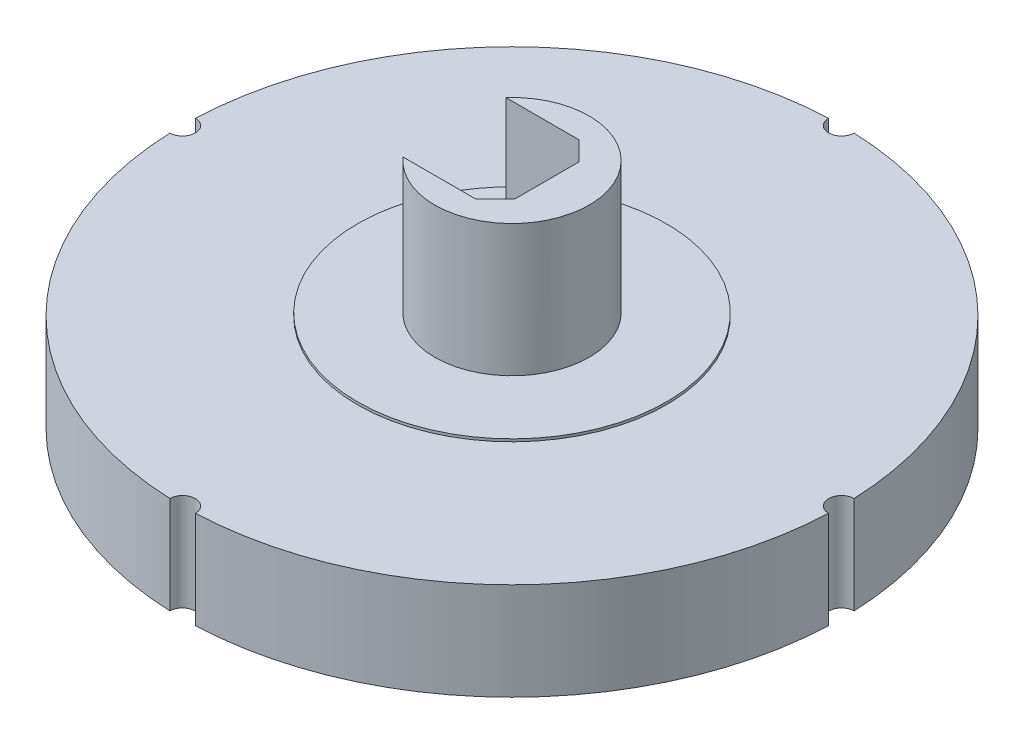
ISO-10303-21;
HEADER;
FILE_DESCRIPTION(('STEP AP214'),'2;1');
FILE_NAME('part.step','',(''),(''),'','','');
FILE_SCHEMA(('AUTOMOTIVE_DESIGN { 1 0 10303 214 1 1 1 1 }'));
ENDSEC;
DATA;
#1=APPLICATION_CONTEXT('core data for automotive mechanical design processes');
#2=APPLICATION_PROTOCOL_DEFINITION('international standard','automotive_design',2000,#1);
#3=PRODUCT_CONTEXT('',#1,'mechanical');
#4=PRODUCT('Part','Part','',(#3));
#5=PRODUCT_RELATED_PRODUCT_CATEGORY('part','',(#4));
#6=PRODUCT_DEFINITION_FORMATION('','',#4);
#7=PRODUCT_DEFINITION_CONTEXT('part definition',#1,'design');
#8=PRODUCT_DEFINITION('design','',#6,#7);
#9=PRODUCT_DEFINITION_SHAPE('','',#8);
#10=(LENGTH_UNIT() NAMED_UNIT(*) SI_UNIT(.MILLI.,.METRE.));
#11=(NAMED_UNIT(*) PLANE_ANGLE_UNIT() SI_UNIT($,.RADIAN.));
#12=(NAMED_UNIT(*) SI_UNIT($,.STERADIAN.) SOLID_ANGLE_UNIT());
#13=UNCERTAINTY_MEASURE_WITH_UNIT(LENGTH_MEASURE(1.E-05),#10,'distance_accuracy_value','');
#14=(GEOMETRIC_REPRESENTATION_CONTEXT(3) GLOBAL_UNCERTAINTY_ASSIGNED_CONTEXT((#13)) GLOBAL_UNIT_ASSIGNED_CONTEXT((#10,
#11,#12)) REPRESENTATION_CONTEXT('',''));
#15=CARTESIAN_POINT('',(0.,0.,0.));
#16=DIRECTION('',(0.,0.,1.));
#17=DIRECTION('',(1.,0.,0.));
#18=AXIS2_PLACEMENT_3D('',#15,#16,#17);
#19=CARTESIAN_POINT('',(0.,8.62025316455697,0.));
#20=DIRECTION('',(0.,1.,0.));
#21=DIRECTION('',(0.,0.,1.));
#22=AXIS2_PLACEMENT_3D('',#19,#20,#21);
#23=CYLINDRICAL_SURFACE('',#22,12.805);
#24=CARTESIAN_POINT('',(0.,3.785,0.));
#25=DIRECTION('',(0.,1.,0.));
#26=DIRECTION('',(0.,0.,1.));
#27=AXIS2_PLACEMENT_3D('',#24,#25,#26);
#28=CIRCLE('',#27,12.805);
#29=CARTESIAN_POINT('',(-0.499904697948046,3.785,-12.7952381882077));
#30=VERTEX_POINT('',#29);
#31=CARTESIAN_POINT('',(-12.7952381882077,3.785,-0.499904697948061));
#32=VERTEX_POINT('',#31);
#33=EDGE_CURVE('E184',#30,#32,#28,.T.);
#34=ORIENTED_EDGE('',*,*,#33,.F.);
#35=DIRECTION('',(0.,-1.,0.));
#36=VECTOR('',#35,1.);
#37=CARTESIAN_POINT('',(-0.499904697948051,4.504994,-12.7952381882077));
#38=LINE('',#37,#36);
#39=CARTESIAN_POINT('',(-0.499904697948073,0.,-12.7952381882077));
#40=VERTEX_POINT('',#39);
#41=EDGE_CURVE('E288',#30,#40,#38,.T.);
#42=ORIENTED_EDGE('',*,*,#41,.T.);
#43=CARTESIAN_POINT('',(0.,0.,0.));
#44=DIRECTION('',(0.,1.,0.));
#45=DIRECTION('',(0.,0.,1.));
#46=AXIS2_PLACEMENT_3D('',#43,#44,#45);
#47=CIRCLE('',#46,12.805);
#48=CARTESIAN_POINT('',(-12.7952381882077,0.,-0.499904697948073));
#49=VERTEX_POINT('',#48);
#50=EDGE_CURVE('E187',#40,#49,#47,.T.);
#51=ORIENTED_EDGE('',*,*,#50,.T.);
#52=DIRECTION('',(0.,-1.,0.));
#53=VECTOR('',#52,1.);
#54=CARTESIAN_POINT('',(-12.7952381882077,4.504994,-0.499904697948052));
#55=LINE('',#54,#53);
#56=EDGE_CURVE('E73',#49,#32,#55,.F.);
#57=ORIENTED_EDGE('',*,*,#56,.T.);
#58=EDGE_LOOP('',(#34,#42,#51,#57));
#59=FACE_BOUND('',#58,.T.);
#60=ADVANCED_FACE('F48',(#59),#23,.T.);
#61=CARTESIAN_POINT('',(-12.7952381882077,3.785,0.499904697948045));
#62=VERTEX_POINT('',#61);
#63=CARTESIAN_POINT('',(-0.499904697948051,3.785,12.7952381882077));
#64=VERTEX_POINT('',#63);
#65=EDGE_CURVE('E177',#62,#64,#28,.T.);
#66=ORIENTED_EDGE('',*,*,#65,.F.);
#67=DIRECTION('',(0.,-1.,0.));
#68=VECTOR('',#67,1.);
#69=CARTESIAN_POINT('',(-12.7952381882077,4.504994,0.499904697948052));
#70=LINE('',#69,#68);
#71=CARTESIAN_POINT('',(-12.7952381882077,0.,0.499904697948073));
#72=VERTEX_POINT('',#71);
#73=EDGE_CURVE('E303',#62,#72,#70,.T.);
#74=ORIENTED_EDGE('',*,*,#73,.T.);
#75=CARTESIAN_POINT('',(-0.499904697948073,0.,12.7952381882077));
#76=VERTEX_POINT('',#75);
#77=EDGE_CURVE('E180',#72,#76,#47,.T.);
#78=ORIENTED_EDGE('',*,*,#77,.T.);
#79=DIRECTION('',(0.,-1.,0.));
#80=VECTOR('',#79,1.);
#81=CARTESIAN_POINT('',(-0.499904697948051,4.504994,12.7952381882077));
#82=LINE('',#81,#80);
#83=EDGE_CURVE('E65',#76,#64,#82,.F.);
#84=ORIENTED_EDGE('',*,*,#83,.T.);
#85=EDGE_LOOP('',(#66,#74,#78,#84));
#86=FACE_BOUND('',#85,.T.);
#87=ADVANCED_FACE('F323',(#86),#23,.T.);
#88=CARTESIAN_POINT('',(12.7952381882077,0.,-0.499904697948073));
#89=VERTEX_POINT('',#88);
#90=CARTESIAN_POINT('',(0.499904697948073,0.,-12.7952381882077));
#91=VERTEX_POINT('',#90);
#92=EDGE_CURVE('E178',#89,#91,#47,.T.);
#93=ORIENTED_EDGE('',*,*,#92,.T.);
#94=DIRECTION('',(0.,-1.,0.));
#95=VECTOR('',#94,1.);
#96=CARTESIAN_POINT('',(0.499904697948051,4.504994,-12.7952381882077));
#97=LINE('',#96,#95);
#98=CARTESIAN_POINT('',(0.499904697948049,3.785,-12.7952381882077));
#99=VERTEX_POINT('',#98);
#100=EDGE_CURVE('E292',#91,#99,#97,.F.);
#101=ORIENTED_EDGE('',*,*,#100,.T.);
#102=CARTESIAN_POINT('',(12.7952381882077,3.785,-0.499904697948053));
#103=VERTEX_POINT('',#102);
#104=EDGE_CURVE('E362',#103,#99,#28,.T.);
#105=ORIENTED_EDGE('',*,*,#104,.F.);
#106=DIRECTION('',(0.,-1.,0.));
#107=VECTOR('',#106,1.);
#108=CARTESIAN_POINT('',(12.7952381882077,4.504994,-0.499904697948052));
#109=LINE('',#108,#107);
#110=EDGE_CURVE('E312',#103,#89,#109,.T.);
#111=ORIENTED_EDGE('',*,*,#110,.T.);
#112=EDGE_LOOP('',(#93,#101,#105,#111));
#113=FACE_BOUND('',#112,.T.);
#114=ADVANCED_FACE('F345',(#113),#23,.T.);
#115=CARTESIAN_POINT('',(0.,9.01,0.));
#116=DIRECTION('',(0.,-1.,0.));
#117=DIRECTION('',(0.,0.,-1.));
#118=AXIS2_PLACEMENT_3D('',#115,#116,#117);
#119=PLANE('',#118);
#120=CARTESIAN_POINT('',(0.,9.01,0.));
#121=DIRECTION('',(0.,1.,0.));
#122=DIRECTION('',(0.,0.,1.));
#123=AXIS2_PLACEMENT_3D('',#120,#121,#122);
#124=CIRCLE('',#123,3.);
#125=CARTESIAN_POINT('',(-2.23606797749979,9.01,2.));
#126=VERTEX_POINT('',#125);
#127=CARTESIAN_POINT('',(-2.23606797749979,9.01,-2.));
#128=VERTEX_POINT('',#127);
#129=EDGE_CURVE('E232',#126,#128,#124,.T.);
#130=ORIENTED_EDGE('',*,*,#129,.T.);
#131=DIRECTION('',(-1.,0.,0.));
#132=VECTOR('',#131,1.);
#133=CARTESIAN_POINT('',(1.35,9.01,-2.));
#134=LINE('',#133,#132);
#135=CARTESIAN_POINT('',(0.599999999999999,9.01,-2.));
#136=VERTEX_POINT('',#135);
#137=EDGE_CURVE('E203',#136,#128,#134,.T.);
#138=ORIENTED_EDGE('',*,*,#137,.F.);
#139=DIRECTION('',(-0.707106781186544,0.,-0.707106781186551));
#140=VECTOR('',#139,1.);
#141=CARTESIAN_POINT('',(1.3,9.01,-1.29999999999999));
#142=LINE('',#141,#140);
#143=CARTESIAN_POINT('',(1.35,9.01,-1.24999999999999));
#144=VERTEX_POINT('',#143);
#145=EDGE_CURVE('E269',#136,#144,#142,.F.);
#146=ORIENTED_EDGE('',*,*,#145,.T.);
#147=DIRECTION('',(0.,0.,-1.));
#148=VECTOR('',#147,1.);
#149=CARTESIAN_POINT('',(1.35,9.01,2.));
#150=LINE('',#149,#148);
#151=CARTESIAN_POINT('',(1.35,9.01,1.24999999999999));
#152=VERTEX_POINT('',#151);
#153=EDGE_CURVE('E211',#152,#144,#150,.T.);
#154=ORIENTED_EDGE('',*,*,#153,.F.);
#155=DIRECTION('',(0.707106781186544,0.,-0.707106781186551));
#156=VECTOR('',#155,1.);
#157=CARTESIAN_POINT('',(1.3,9.01,1.29999999999999));
#158=LINE('',#157,#156);
#159=CARTESIAN_POINT('',(0.6,9.01,2.));
#160=VERTEX_POINT('',#159);
#161=EDGE_CURVE('E159',#152,#160,#158,.F.);
#162=ORIENTED_EDGE('',*,*,#161,.T.);
#163=DIRECTION('',(1.,0.,0.));
#164=VECTOR('',#163,1.);
#165=CARTESIAN_POINT('',(1.35,9.01,2.));
#166=LINE('',#165,#164);
#167=EDGE_CURVE('E207',#126,#160,#166,.T.);
#168=ORIENTED_EDGE('',*,*,#167,.F.);
#169=EDGE_LOOP('',(#130,#138,#146,#154,#162,#168));
#170=FACE_BOUND('',#169,.T.);
#171=ADVANCED_FACE('F238',(#170),#119,.F.);
#172=CARTESIAN_POINT('',(0.,8.62025316455697,0.));
#173=DIRECTION('',(0.,1.,0.));
#174=DIRECTION('',(0.,0.,1.));
#175=AXIS2_PLACEMENT_3D('',#172,#173,#174);
#176=CYLINDRICAL_SURFACE('',#175,3.);
#177=CARTESIAN_POINT('',(0.,4.51,0.));
#178=DIRECTION('',(0.,1.,0.));
#179=DIRECTION('',(0.,0.,1.));
#180=AXIS2_PLACEMENT_3D('',#177,#178,#179);
#181=CIRCLE('',#180,3.);
#182=CARTESIAN_POINT('',(-2.23606797749979,4.51,-2.));
#183=VERTEX_POINT('',#182);
#184=CARTESIAN_POINT('',(-2.23606797749979,4.51,2.));
#185=VERTEX_POINT('',#184);
#186=EDGE_CURVE('E233',#183,#185,#181,.T.);
#187=ORIENTED_EDGE('',*,*,#186,.F.);
#188=DIRECTION('',(0.,1.,0.));
#189=VECTOR('',#188,1.);
#190=CARTESIAN_POINT('',(-2.23606797749979,8.62025316455697,-2.));
#191=LINE('',#190,#189);
#192=EDGE_CURVE('E221',#183,#128,#191,.T.);
#193=ORIENTED_EDGE('',*,*,#192,.T.);
#194=ORIENTED_EDGE('',*,*,#129,.F.);
#195=DIRECTION('',(0.,1.,0.));
#196=VECTOR('',#195,1.);
#197=CARTESIAN_POINT('',(-2.23606797749979,8.62025316455697,2.));
#198=LINE('',#197,#196);
#199=EDGE_CURVE('E235',#126,#185,#198,.F.);
#200=ORIENTED_EDGE('',*,*,#199,.T.);
#201=EDGE_LOOP('',(#187,#193,#194,#200));
#202=FACE_BOUND('',#201,.T.);
#203=CARTESIAN_POINT('',(0.,3.885,0.));
#204=DIRECTION('',(0.,1.,0.));
#205=DIRECTION('',(0.,0.,1.));
#206=AXIS2_PLACEMENT_3D('',#203,#204,#205);
#207=CIRCLE('',#206,3.);
#208=CARTESIAN_POINT('',(0.,3.885,3.));
#209=VERTEX_POINT('',#208);
#210=EDGE_CURVE('E240',#209,#209,#207,.T.);
#211=ORIENTED_EDGE('',*,*,#210,.T.);
#212=EDGE_LOOP('',(#211));
#213=FACE_BOUND('',#212,.T.);
#214=ADVANCED_FACE('F229',(#202,#213),#176,.T.);
#215=CARTESIAN_POINT('',(3.,3.885,0.));
#216=DIRECTION('',(0.,-1.,0.));
#217=DIRECTION('',(0.,0.,-1.));
#218=AXIS2_PLACEMENT_3D('',#215,#216,#217);
#219=PLANE('',#218);
#220=ORIENTED_EDGE('',*,*,#210,.F.);
#221=EDGE_LOOP('',(#220));
#222=FACE_BOUND('',#221,.T.);
#223=CARTESIAN_POINT('',(0.,3.885,0.));
#224=DIRECTION('',(0.,1.,0.));
#225=DIRECTION('',(0.,0.,1.));
#226=AXIS2_PLACEMENT_3D('',#223,#224,#225);
#227=CIRCLE('',#226,6.);
#228=CARTESIAN_POINT('',(0.,3.885,6.));
#229=VERTEX_POINT('',#228);
#230=EDGE_CURVE('E246',#229,#229,#227,.T.);
#231=ORIENTED_EDGE('',*,*,#230,.T.);
#232=EDGE_LOOP('',(#231));
#233=FACE_BOUND('',#232,.T.);
#234=ADVANCED_FACE('F374',(#222,#233),#219,.F.);
#235=CARTESIAN_POINT('',(0.,8.62025316455697,0.));
#236=DIRECTION('',(0.,1.,0.));
#237=DIRECTION('',(0.,0.,1.));
#238=AXIS2_PLACEMENT_3D('',#235,#236,#237);
#239=CYLINDRICAL_SURFACE('',#238,6.);
#240=ORIENTED_EDGE('',*,*,#230,.F.);
#241=EDGE_LOOP('',(#240));
#242=FACE_BOUND('',#241,.T.);
#243=CARTESIAN_POINT('',(0.,3.785,0.));
#244=DIRECTION('',(0.,1.,0.));
#245=DIRECTION('',(0.,0.,1.));
#246=AXIS2_PLACEMENT_3D('',#243,#244,#245);
#247=CIRCLE('',#246,6.);
#248=CARTESIAN_POINT('',(0.,3.785,6.));
#249=VERTEX_POINT('',#248);
#250=EDGE_CURVE('E366',#249,#249,#247,.T.);
#251=ORIENTED_EDGE('',*,*,#250,.T.);
#252=EDGE_LOOP('',(#251));
#253=FACE_BOUND('',#252,.T.);
#254=ADVANCED_FACE('F353',(#242,#253),#239,.T.);
#255=CARTESIAN_POINT('',(6.,3.785,0.));
#256=DIRECTION('',(0.,-1.,0.));
#257=DIRECTION('',(0.,0.,-1.));
#258=AXIS2_PLACEMENT_3D('',#255,#256,#257);
#259=PLANE('',#258);
#260=ORIENTED_EDGE('',*,*,#250,.F.);
#261=EDGE_LOOP('',(#260));
#262=FACE_BOUND('',#261,.T.);
#263=ORIENTED_EDGE('',*,*,#104,.T.);
#264=CARTESIAN_POINT('',(0.,3.785,-12.805));
#265=DIRECTION('',(0.,-1.,0.));
#266=DIRECTION('',(0.,0.,-1.));
#267=AXIS2_PLACEMENT_3D('',#264,#265,#266);
#268=CIRCLE('',#267,0.5);
#269=EDGE_CURVE('E278',#99,#30,#268,.T.);
#270=ORIENTED_EDGE('',*,*,#269,.T.);
#271=ORIENTED_EDGE('',*,*,#33,.T.);
#272=CARTESIAN_POINT('',(-12.805,3.785,0.));
#273=DIRECTION('',(0.,-1.,0.));
#274=DIRECTION('',(0.,0.,-1.));
#275=AXIS2_PLACEMENT_3D('',#272,#273,#274);
#276=CIRCLE('',#275,0.500000000000001);
#277=EDGE_CURVE('E297',#32,#62,#276,.T.);
#278=ORIENTED_EDGE('',*,*,#277,.T.);
#279=ORIENTED_EDGE('',*,*,#65,.T.);
#280=CARTESIAN_POINT('',(0.,3.785,12.805));
#281=DIRECTION('',(0.,-1.,0.));
#282=DIRECTION('',(0.,0.,-1.));
#283=AXIS2_PLACEMENT_3D('',#280,#281,#282);
#284=CIRCLE('',#283,0.5);
#285=CARTESIAN_POINT('',(0.499904697948051,3.785,12.7952381882077));
#286=VERTEX_POINT('',#285);
#287=EDGE_CURVE('E170',#64,#286,#284,.T.);
#288=ORIENTED_EDGE('',*,*,#287,.T.);
#289=CARTESIAN_POINT('',(12.7952381882077,3.785,0.499904697948051));
#290=VERTEX_POINT('',#289);
#291=EDGE_CURVE('E168',#286,#290,#28,.T.);
#292=ORIENTED_EDGE('',*,*,#291,.T.);
#293=CARTESIAN_POINT('',(12.805,3.785,0.));
#294=DIRECTION('',(0.,-1.,0.));
#295=DIRECTION('',(0.,0.,-1.));
#296=AXIS2_PLACEMENT_3D('',#293,#294,#295);
#297=CIRCLE('',#296,0.500000000000001);
#298=EDGE_CURVE('E308',#290,#103,#297,.T.);
#299=ORIENTED_EDGE('',*,*,#298,.T.);
#300=EDGE_LOOP('',(#263,#270,#271,#278,#279,#288,#292,#299));
#301=FACE_BOUND('',#300,.T.);
#302=ADVANCED_FACE('F326',(#262,#301),#259,.F.);
#303=CARTESIAN_POINT('',(0.499904697948073,0.,12.7952381882077));
#304=VERTEX_POINT('',#303);
#305=CARTESIAN_POINT('',(12.7952381882077,0.,0.499904697948073));
#306=VERTEX_POINT('',#305);
#307=EDGE_CURVE('E166',#304,#306,#47,.T.);
#308=ORIENTED_EDGE('',*,*,#307,.T.);
#309=DIRECTION('',(0.,-1.,0.));
#310=VECTOR('',#309,1.);
#311=CARTESIAN_POINT('',(12.7952381882077,4.504994,0.499904697948052));
#312=LINE('',#311,#310);
#313=EDGE_CURVE('E316',#306,#290,#312,.F.);
#314=ORIENTED_EDGE('',*,*,#313,.T.);
#315=ORIENTED_EDGE('',*,*,#291,.F.);
#316=DIRECTION('',(0.,-1.,0.));
#317=VECTOR('',#316,1.);
#318=CARTESIAN_POINT('',(0.499904697948051,4.504994,12.7952381882077));
#319=LINE('',#318,#317);
#320=EDGE_CURVE('E151',#286,#304,#319,.T.);
#321=ORIENTED_EDGE('',*,*,#320,.T.);
#322=EDGE_LOOP('',(#308,#314,#315,#321));
#323=FACE_BOUND('',#322,.T.);
#324=ADVANCED_FACE('F164',(#323),#23,.T.);
#325=CARTESIAN_POINT('',(12.805,0.,0.));
#326=DIRECTION('',(0.,1.,0.));
#327=DIRECTION('',(0.,0.,1.));
#328=AXIS2_PLACEMENT_3D('',#325,#326,#327);
#329=PLANE('',#328);
#330=ORIENTED_EDGE('',*,*,#50,.F.);
#331=CARTESIAN_POINT('',(0.,0.,-12.805));
#332=DIRECTION('',(0.,1.,0.));
#333=DIRECTION('',(0.,0.,1.));
#334=AXIS2_PLACEMENT_3D('',#331,#332,#333);
#335=CIRCLE('',#334,0.5);
#336=EDGE_CURVE('E12',#40,#91,#335,.T.);
#337=ORIENTED_EDGE('',*,*,#336,.T.);
#338=ORIENTED_EDGE('',*,*,#92,.F.);
#339=CARTESIAN_POINT('',(12.805,0.,0.));
#340=DIRECTION('',(0.,1.,0.));
#341=DIRECTION('',(0.,0.,1.));
#342=AXIS2_PLACEMENT_3D('',#339,#340,#341);
#343=CIRCLE('',#342,0.500000000000001);
#344=EDGE_CURVE('E158',#89,#306,#343,.T.);
#345=ORIENTED_EDGE('',*,*,#344,.T.);
#346=ORIENTED_EDGE('',*,*,#307,.F.);
#347=CARTESIAN_POINT('',(0.,0.,12.805));
#348=DIRECTION('',(0.,1.,0.));
#349=DIRECTION('',(0.,0.,1.));
#350=AXIS2_PLACEMENT_3D('',#347,#348,#349);
#351=CIRCLE('',#350,0.5);
#352=EDGE_CURVE('E148',#304,#76,#351,.T.);
#353=ORIENTED_EDGE('',*,*,#352,.T.);
#354=ORIENTED_EDGE('',*,*,#77,.F.);
#355=CARTESIAN_POINT('',(-12.805,0.,0.));
#356=DIRECTION('',(0.,1.,0.));
#357=DIRECTION('',(0.,0.,1.));
#358=AXIS2_PLACEMENT_3D('',#355,#356,#357);
#359=CIRCLE('',#358,0.500000000000001);
#360=EDGE_CURVE('E58',#72,#49,#359,.T.);
#361=ORIENTED_EDGE('',*,*,#360,.T.);
#362=EDGE_LOOP('',(#330,#337,#338,#345,#346,#353,#354,#361));
#363=FACE_BOUND('',#362,.T.);
#364=ADVANCED_FACE('F174',(#363),#329,.F.);
#365=CARTESIAN_POINT('',(1.35,4.51,-2.));
#366=DIRECTION('',(0.,0.,-1.));
#367=DIRECTION('',(-1.,0.,0.));
#368=AXIS2_PLACEMENT_3D('',#365,#366,#367);
#369=PLANE('',#368);
#370=DIRECTION('',(-1.,0.,0.));
#371=VECTOR('',#370,1.);
#372=CARTESIAN_POINT('',(1.35,4.51,-2.));
#373=LINE('',#372,#371);
#374=CARTESIAN_POINT('',(0.599999999999999,4.51,-2.));
#375=VERTEX_POINT('',#374);
#376=EDGE_CURVE('E190',#375,#183,#373,.T.);
#377=ORIENTED_EDGE('',*,*,#376,.F.);
#378=DIRECTION('',(0.,1.,0.));
#379=VECTOR('',#378,1.);
#380=CARTESIAN_POINT('',(0.599999999999999,9.01,-2.));
#381=LINE('',#380,#379);
#382=EDGE_CURVE('E224',#375,#136,#381,.T.);
#383=ORIENTED_EDGE('',*,*,#382,.T.);
#384=ORIENTED_EDGE('',*,*,#137,.T.);
#385=ORIENTED_EDGE('',*,*,#192,.F.);
#386=EDGE_LOOP('',(#377,#383,#384,#385));
#387=FACE_BOUND('',#386,.T.);
#388=ADVANCED_FACE('F220',(#387),#369,.F.);
#389=CARTESIAN_POINT('',(1.35,4.51,2.));
#390=DIRECTION('',(0.,0.,1.));
#391=DIRECTION('',(1.,0.,0.));
#392=AXIS2_PLACEMENT_3D('',#389,#390,#391);
#393=PLANE('',#392);
#394=ORIENTED_EDGE('',*,*,#167,.T.);
#395=DIRECTION('',(0.,-1.,0.));
#396=VECTOR('',#395,1.);
#397=CARTESIAN_POINT('',(0.6,4.51,2.));
#398=LINE('',#397,#396);
#399=CARTESIAN_POINT('',(0.6,4.51,2.));
#400=VERTEX_POINT('',#399);
#401=EDGE_CURVE('E266',#160,#400,#398,.T.);
#402=ORIENTED_EDGE('',*,*,#401,.T.);
#403=DIRECTION('',(1.,0.,0.));
#404=VECTOR('',#403,1.);
#405=CARTESIAN_POINT('',(1.35,4.51,2.));
#406=LINE('',#405,#404);
#407=EDGE_CURVE('E196',#185,#400,#406,.T.);
#408=ORIENTED_EDGE('',*,*,#407,.F.);
#409=ORIENTED_EDGE('',*,*,#199,.F.);
#410=EDGE_LOOP('',(#394,#402,#408,#409));
#411=FACE_BOUND('',#410,.T.);
#412=ADVANCED_FACE('F415',(#411),#393,.F.);
#413=CARTESIAN_POINT('',(0.,4.51,0.));
#414=DIRECTION('',(0.,1.,0.));
#415=DIRECTION('',(0.,0.,1.));
#416=AXIS2_PLACEMENT_3D('',#413,#414,#415);
#417=PLANE('',#416);
#418=ORIENTED_EDGE('',*,*,#407,.T.);
#419=DIRECTION('',(0.,0.,-1.));
#420=VECTOR('',#419,1.);
#421=CARTESIAN_POINT('',(0.599999999999999,4.51,0.));
#422=LINE('',#421,#420);
#423=EDGE_CURVE('E263',#400,#375,#422,.T.);
#424=ORIENTED_EDGE('',*,*,#423,.T.);
#425=ORIENTED_EDGE('',*,*,#376,.T.);
#426=ORIENTED_EDGE('',*,*,#186,.T.);
#427=EDGE_LOOP('',(#418,#424,#425,#426));
#428=FACE_BOUND('',#427,.T.);
#429=ADVANCED_FACE('F417',(#428),#417,.T.);
#430=CARTESIAN_POINT('',(1.35,4.51,2.));
#431=DIRECTION('',(1.,0.,0.));
#432=DIRECTION('',(0.,0.,-1.));
#433=AXIS2_PLACEMENT_3D('',#430,#431,#432);
#434=PLANE('',#433);
#435=ORIENTED_EDGE('',*,*,#153,.T.);
#436=DIRECTION('',(0.,-1.,0.));
#437=VECTOR('',#436,1.);
#438=CARTESIAN_POINT('',(1.35,4.51,-1.24999999999999));
#439=LINE('',#438,#437);
#440=CARTESIAN_POINT('',(1.35,5.26000000000001,-1.24999999999999));
#441=VERTEX_POINT('',#440);
#442=EDGE_CURVE('E260',#144,#441,#439,.T.);
#443=ORIENTED_EDGE('',*,*,#442,.T.);
#444=DIRECTION('',(0.,0.,1.));
#445=VECTOR('',#444,1.);
#446=CARTESIAN_POINT('',(1.35,5.26000000000001,2.));
#447=LINE('',#446,#445);
#448=CARTESIAN_POINT('',(1.35,5.26000000000001,1.24999999999999));
#449=VERTEX_POINT('',#448);
#450=EDGE_CURVE('E257',#441,#449,#447,.T.);
#451=ORIENTED_EDGE('',*,*,#450,.T.);
#452=DIRECTION('',(0.,1.,0.));
#453=VECTOR('',#452,1.);
#454=CARTESIAN_POINT('',(1.35,9.01,1.24999999999999));
#455=LINE('',#454,#453);
#456=EDGE_CURVE('E254',#449,#152,#455,.T.);
#457=ORIENTED_EDGE('',*,*,#456,.T.);
#458=EDGE_LOOP('',(#435,#443,#451,#457));
#459=FACE_BOUND('',#458,.T.);
#460=ADVANCED_FACE('F402',(#459),#434,.F.);
#461=CARTESIAN_POINT('',(1.35,4.51,1.24999999999999));
#462=DIRECTION('',(-0.707106781186551,0.,-0.707106781186544));
#463=DIRECTION('',(0.,-1.,0.));
#464=AXIS2_PLACEMENT_3D('',#461,#462,#463);
#465=PLANE('',#464);
#466=ORIENTED_EDGE('',*,*,#161,.F.);
#467=ORIENTED_EDGE('',*,*,#456,.F.);
#468=DIRECTION('',(0.577350269189622,0.577350269189628,-0.577350269189628));
#469=VECTOR('',#468,1.);
#470=CARTESIAN_POINT('',(1.26666666666666,5.17666666666667,1.33333333333333));
#471=LINE('',#470,#469);
#472=EDGE_CURVE('E212',#400,#449,#471,.T.);
#473=ORIENTED_EDGE('',*,*,#472,.F.);
#474=ORIENTED_EDGE('',*,*,#401,.F.);
#475=EDGE_LOOP('',(#466,#467,#473,#474));
#476=FACE_BOUND('',#475,.T.);
#477=ADVANCED_FACE('F51',(#476),#465,.T.);
#478=CARTESIAN_POINT('',(0.599999999999999,4.51,0.));
#479=DIRECTION('',(0.707106781186551,-0.707106781186544,0.));
#480=DIRECTION('',(0.,0.,-1.));
#481=AXIS2_PLACEMENT_3D('',#478,#479,#480);
#482=PLANE('',#481);
#483=ORIENTED_EDGE('',*,*,#472,.T.);
#484=ORIENTED_EDGE('',*,*,#450,.F.);
#485=DIRECTION('',(0.577350269189622,0.577350269189628,0.577350269189628));
#486=VECTOR('',#485,1.);
#487=CARTESIAN_POINT('',(0.599999999999999,4.51,-2.));
#488=LINE('',#487,#486);
#489=EDGE_CURVE('E274',#375,#441,#488,.T.);
#490=ORIENTED_EDGE('',*,*,#489,.F.);
#491=ORIENTED_EDGE('',*,*,#423,.F.);
#492=EDGE_LOOP('',(#483,#484,#490,#491));
#493=FACE_BOUND('',#492,.T.);
#494=ADVANCED_FACE('F393',(#493),#482,.F.);
#495=CARTESIAN_POINT('',(0.599999999999999,4.51,-2.));
#496=DIRECTION('',(-0.707106781186551,0.,0.707106781186544));
#497=DIRECTION('',(0.,-1.,0.));
#498=AXIS2_PLACEMENT_3D('',#495,#496,#497);
#499=PLANE('',#498);
#500=ORIENTED_EDGE('',*,*,#489,.T.);
#501=ORIENTED_EDGE('',*,*,#442,.F.);
#502=ORIENTED_EDGE('',*,*,#145,.F.);
#503=ORIENTED_EDGE('',*,*,#382,.F.);
#504=EDGE_LOOP('',(#500,#501,#502,#503));
#505=FACE_BOUND('',#504,.T.);
#506=ADVANCED_FACE('F389',(#505),#499,.T.);
#507=CARTESIAN_POINT('',(0.,9.01,12.805));
#508=DIRECTION('',(0.,-1.,0.));
#509=DIRECTION('',(0.,0.,-1.));
#510=AXIS2_PLACEMENT_3D('',#507,#508,#509);
#511=CYLINDRICAL_SURFACE('',#510,0.5);
#512=ORIENTED_EDGE('',*,*,#83,.F.);
#513=ORIENTED_EDGE('',*,*,#352,.F.);
#514=ORIENTED_EDGE('',*,*,#320,.F.);
#515=ORIENTED_EDGE('',*,*,#287,.F.);
#516=EDGE_LOOP('',(#512,#513,#514,#515));
#517=FACE_BOUND('',#516,.T.);
#518=ADVANCED_FACE('F150',(#517),#511,.F.);
#519=CARTESIAN_POINT('',(12.805,9.01,0.));
#520=DIRECTION('',(0.,-1.,0.));
#521=DIRECTION('',(0.,0.,-1.));
#522=AXIS2_PLACEMENT_3D('',#519,#520,#521);
#523=CYLINDRICAL_SURFACE('',#522,0.500000000000001);
#524=ORIENTED_EDGE('',*,*,#313,.F.);
#525=ORIENTED_EDGE('',*,*,#344,.F.);
#526=ORIENTED_EDGE('',*,*,#110,.F.);
#527=ORIENTED_EDGE('',*,*,#298,.F.);
#528=EDGE_LOOP('',(#524,#525,#526,#527));
#529=FACE_BOUND('',#528,.T.);
#530=ADVANCED_FACE('F330',(#529),#523,.F.);
#531=CARTESIAN_POINT('',(-12.805,9.01,0.));
#532=DIRECTION('',(0.,-1.,0.));
#533=DIRECTION('',(0.,0.,-1.));
#534=AXIS2_PLACEMENT_3D('',#531,#532,#533);
#535=CYLINDRICAL_SURFACE('',#534,0.500000000000001);
#536=ORIENTED_EDGE('',*,*,#56,.F.);
#537=ORIENTED_EDGE('',*,*,#360,.F.);
#538=ORIENTED_EDGE('',*,*,#73,.F.);
#539=ORIENTED_EDGE('',*,*,#277,.F.);
#540=EDGE_LOOP('',(#536,#537,#538,#539));
#541=FACE_BOUND('',#540,.T.);
#542=ADVANCED_FACE('F327',(#541),#535,.F.);
#543=CARTESIAN_POINT('',(0.,9.01,-12.805));
#544=DIRECTION('',(0.,-1.,0.));
#545=DIRECTION('',(0.,0.,-1.));
#546=AXIS2_PLACEMENT_3D('',#543,#544,#545);
#547=CYLINDRICAL_SURFACE('',#546,0.5);
#548=ORIENTED_EDGE('',*,*,#100,.F.);
#549=ORIENTED_EDGE('',*,*,#336,.F.);
#550=ORIENTED_EDGE('',*,*,#41,.F.);
#551=ORIENTED_EDGE('',*,*,#269,.F.);
#552=EDGE_LOOP('',(#548,#549,#550,#551));
#553=FACE_BOUND('',#552,.T.);
#554=ADVANCED_FACE('F329',(#553),#547,.F.);
#555=CLOSED_SHELL('',(#60,#87,#114,#171,#214,#234,#254,#302,#324,#364,#388,#412,#429,#460,#477,
#494,#506,#518,#530,#542,#554));
#556=MANIFOLD_SOLID_BREP('B2',#555);
#557=ADVANCED_BREP_SHAPE_REPRESENTATION('',(#18,#556),#14);
#558=SHAPE_DEFINITION_REPRESENTATION(#9,#557);
ENDSEC;
END-ISO-10303-21;
